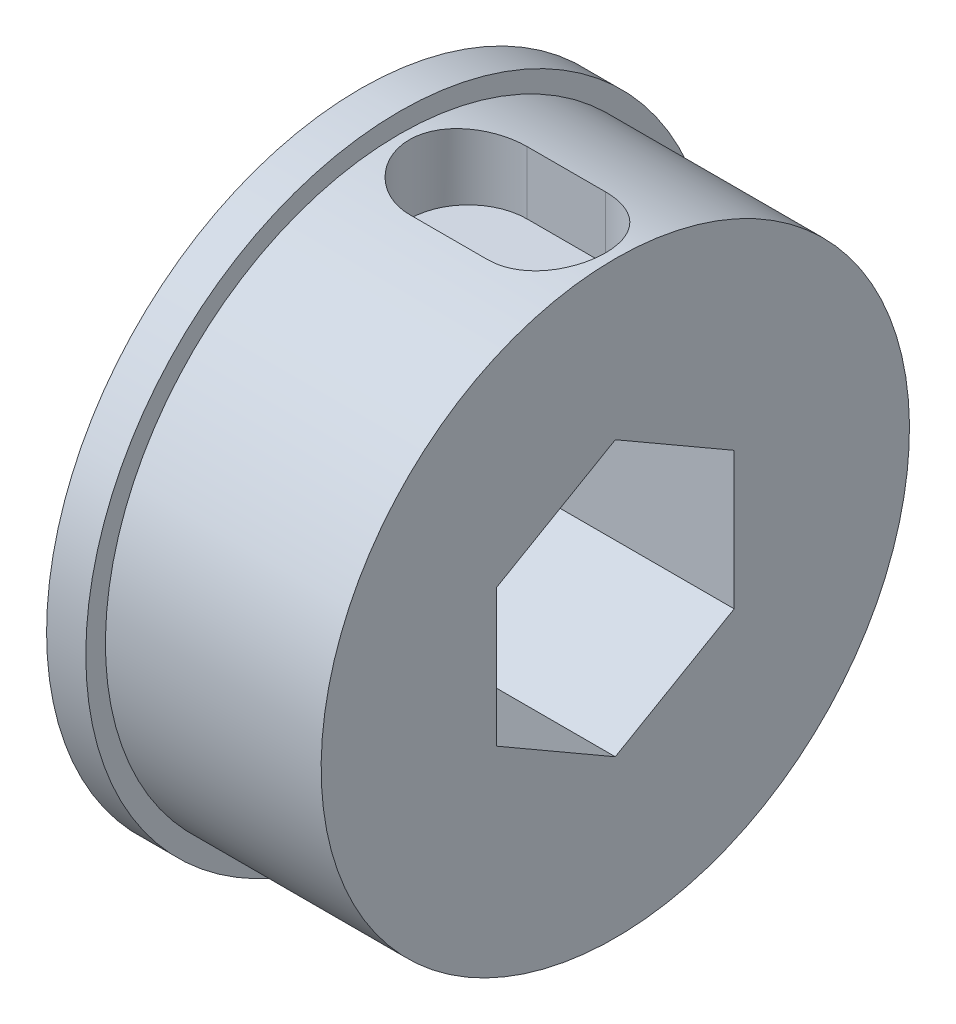
ISO-10303-21;
HEADER;
FILE_DESCRIPTION(('STEP AP214'),'2;1');
FILE_NAME('part.step','',(''),(''),'','','');
FILE_SCHEMA(('AUTOMOTIVE_DESIGN { 1 0 10303 214 1 1 1 1 }'));
ENDSEC;
DATA;
#1=APPLICATION_CONTEXT('core data for automotive mechanical design processes');
#2=APPLICATION_PROTOCOL_DEFINITION('international standard','automotive_design',2000,#1);
#3=PRODUCT_CONTEXT('',#1,'mechanical');
#4=PRODUCT('Part','Part','',(#3));
#5=PRODUCT_RELATED_PRODUCT_CATEGORY('part','',(#4));
#6=PRODUCT_DEFINITION_FORMATION('','',#4);
#7=PRODUCT_DEFINITION_CONTEXT('part definition',#1,'design');
#8=PRODUCT_DEFINITION('design','',#6,#7);
#9=PRODUCT_DEFINITION_SHAPE('','',#8);
#10=(LENGTH_UNIT() NAMED_UNIT(*) SI_UNIT(.MILLI.,.METRE.));
#11=(NAMED_UNIT(*) PLANE_ANGLE_UNIT() SI_UNIT($,.RADIAN.));
#12=(NAMED_UNIT(*) SI_UNIT($,.STERADIAN.) SOLID_ANGLE_UNIT());
#13=UNCERTAINTY_MEASURE_WITH_UNIT(LENGTH_MEASURE(1.E-05),#10,'distance_accuracy_value','');
#14=(GEOMETRIC_REPRESENTATION_CONTEXT(3) GLOBAL_UNCERTAINTY_ASSIGNED_CONTEXT((#13)) GLOBAL_UNIT_ASSIGNED_CONTEXT((#10,
#11,#12)) REPRESENTATION_CONTEXT('',''));
#15=CARTESIAN_POINT('',(0.,0.,0.));
#16=DIRECTION('',(0.,0.,1.));
#17=DIRECTION('',(1.,0.,0.));
#18=AXIS2_PLACEMENT_3D('',#15,#16,#17);
#19=CARTESIAN_POINT('',(0.,0.,0.));
#20=DIRECTION('',(-1.,0.,0.));
#21=DIRECTION('',(0.,-1.,0.));
#22=AXIS2_PLACEMENT_3D('',#19,#20,#21);
#23=PLANE('',#22);
#24=DIRECTION('',(0.,0.5,0.866025403784439));
#25=VECTOR('',#24,1.);
#26=CARTESIAN_POINT('',(0.,3.5,-6.06217782649107));
#27=LINE('',#26,#25);
#28=CARTESIAN_POINT('',(0.,3.5,-6.06217782649107));
#29=VERTEX_POINT('',#28);
#30=CARTESIAN_POINT('',(0.,7.,0.));
#31=VERTEX_POINT('',#30);
#32=EDGE_CURVE('E154',#29,#31,#27,.T.);
#33=ORIENTED_EDGE('',*,*,#32,.T.);
#34=DIRECTION('',(0.,-0.5,0.866025403784439));
#35=VECTOR('',#34,1.);
#36=CARTESIAN_POINT('',(0.,7.,0.));
#37=LINE('',#36,#35);
#38=CARTESIAN_POINT('',(0.,3.5,6.06217782649107));
#39=VERTEX_POINT('',#38);
#40=EDGE_CURVE('E158',#31,#39,#37,.T.);
#41=ORIENTED_EDGE('',*,*,#40,.T.);
#42=DIRECTION('',(0.,-1.,0.));
#43=VECTOR('',#42,1.);
#44=CARTESIAN_POINT('',(0.,3.5,6.06217782649107));
#45=LINE('',#44,#43);
#46=CARTESIAN_POINT('',(0.,-3.5,6.06217782649107));
#47=VERTEX_POINT('',#46);
#48=EDGE_CURVE('E61',#39,#47,#45,.T.);
#49=ORIENTED_EDGE('',*,*,#48,.T.);
#50=DIRECTION('',(0.,-0.5,-0.866025403784439));
#51=VECTOR('',#50,1.);
#52=CARTESIAN_POINT('',(0.,-3.5,6.06217782649107));
#53=LINE('',#52,#51);
#54=CARTESIAN_POINT('',(0.,-7.,0.));
#55=VERTEX_POINT('',#54);
#56=EDGE_CURVE('E165',#47,#55,#53,.T.);
#57=ORIENTED_EDGE('',*,*,#56,.T.);
#58=DIRECTION('',(0.,0.5,-0.866025403784439));
#59=VECTOR('',#58,1.);
#60=CARTESIAN_POINT('',(0.,-7.,0.));
#61=LINE('',#60,#59);
#62=CARTESIAN_POINT('',(0.,-3.5,-6.06217782649107));
#63=VERTEX_POINT('',#62);
#64=EDGE_CURVE('E169',#55,#63,#61,.T.);
#65=ORIENTED_EDGE('',*,*,#64,.T.);
#66=DIRECTION('',(0.,1.,0.));
#67=VECTOR('',#66,1.);
#68=CARTESIAN_POINT('',(0.,-3.5,-6.06217782649107));
#69=LINE('',#68,#67);
#70=EDGE_CURVE('E173',#63,#29,#69,.T.);
#71=ORIENTED_EDGE('',*,*,#70,.T.);
#72=EDGE_LOOP('',(#33,#41,#49,#57,#65,#71));
#73=FACE_BOUND('',#72,.T.);
#74=CARTESIAN_POINT('',(0.,0.,0.));
#75=DIRECTION('',(1.,0.,0.));
#76=DIRECTION('',(0.,1.,0.));
#77=AXIS2_PLACEMENT_3D('',#74,#75,#76);
#78=CIRCLE('',#77,16.);
#79=CARTESIAN_POINT('',(0.,16.,0.));
#80=VERTEX_POINT('',#79);
#81=EDGE_CURVE('E229',#80,#80,#78,.T.);
#82=ORIENTED_EDGE('',*,*,#81,.F.);
#83=EDGE_LOOP('',(#82));
#84=FACE_BOUND('',#83,.T.);
#85=ADVANCED_FACE('F39',(#73,#84),#23,.T.);
#86=CARTESIAN_POINT('',(13.,0.,0.));
#87=DIRECTION('',(1.,0.,0.));
#88=DIRECTION('',(0.,1.,0.));
#89=AXIS2_PLACEMENT_3D('',#86,#87,#88);
#90=CYLINDRICAL_SURFACE('',#89,16.);
#91=ORIENTED_EDGE('',*,*,#81,.T.);
#92=EDGE_LOOP('',(#91));
#93=FACE_BOUND('',#92,.T.);
#94=CARTESIAN_POINT('',(2.,0.,0.));
#95=DIRECTION('',(1.,0.,0.));
#96=DIRECTION('',(0.,1.,0.));
#97=AXIS2_PLACEMENT_3D('',#94,#95,#96);
#98=CIRCLE('',#97,16.);
#99=CARTESIAN_POINT('',(2.,16.,0.));
#100=VERTEX_POINT('',#99);
#101=EDGE_CURVE('E225',#100,#100,#98,.T.);
#102=ORIENTED_EDGE('',*,*,#101,.F.);
#103=EDGE_LOOP('',(#102));
#104=FACE_BOUND('',#103,.T.);
#105=ADVANCED_FACE('F291',(#93,#104),#90,.T.);
#106=CARTESIAN_POINT('',(2.,15.,0.));
#107=DIRECTION('',(1.,0.,0.));
#108=DIRECTION('',(0.,1.,0.));
#109=AXIS2_PLACEMENT_3D('',#106,#107,#108);
#110=PLANE('',#109);
#111=ORIENTED_EDGE('',*,*,#101,.T.);
#112=EDGE_LOOP('',(#111));
#113=FACE_BOUND('',#112,.T.);
#114=CARTESIAN_POINT('',(2.,0.,0.));
#115=DIRECTION('',(1.,0.,0.));
#116=DIRECTION('',(0.,1.,0.));
#117=AXIS2_PLACEMENT_3D('',#114,#115,#116);
#118=CIRCLE('',#117,15.);
#119=CARTESIAN_POINT('',(2.,15.,0.));
#120=VERTEX_POINT('',#119);
#121=EDGE_CURVE('E221',#120,#120,#118,.T.);
#122=ORIENTED_EDGE('',*,*,#121,.F.);
#123=EDGE_LOOP('',(#122));
#124=FACE_BOUND('',#123,.T.);
#125=ADVANCED_FACE('F276',(#113,#124),#110,.T.);
#126=CARTESIAN_POINT('',(13.,0.,0.));
#127=DIRECTION('',(1.,0.,0.));
#128=DIRECTION('',(0.,1.,0.));
#129=AXIS2_PLACEMENT_3D('',#126,#127,#128);
#130=CYLINDRICAL_SURFACE('',#129,15.);
#131=CARTESIAN_POINT('',(9.5,14.6969384566991,3.));
#132=CARTESIAN_POINT('',(9.58347680857854,14.6969312244577,3.00000906327289));
#133=CARTESIAN_POINT('',(9.66694861026169,14.6976495056175,2.99651591463671));
#134=CARTESIAN_POINT('',(9.83327809996906,14.7004835434339,2.98259549441824));
#135=CARTESIAN_POINT('',(9.91613586268055,14.7025991272148,2.97216908062491));
#136=CARTESIAN_POINT('',(10.0805290959827,14.708170006848,2.94447346178657));
#137=CARTESIAN_POINT('',(10.1620663848963,14.7116232616092,2.92721468106147));
#138=CARTESIAN_POINT('',(10.3233464127035,14.7197622168639,2.88600721568467));
#139=CARTESIAN_POINT('',(10.4030891442697,14.7244479223887,2.86205850372287));
#140=CARTESIAN_POINT('',(10.638805705615,14.7401631005323,2.78041527952091));
#141=CARTESIAN_POINT('',(10.7913980579565,14.7528553636172,2.71290158046862));
#142=CARTESIAN_POINT('',(11.0830273827463,14.7812320879208,2.55375565119918));
#143=CARTESIAN_POINT('',(11.2220629482138,14.7969168592162,2.46212092124304));
#144=CARTESIAN_POINT('',(11.4846705779563,14.829758124629,2.25594334606255));
#145=CARTESIAN_POINT('',(11.608026452483,14.8469306312349,2.14112719277709));
#146=CARTESIAN_POINT('',(11.8338657124384,14.8806728038384,1.89243128558791));
#147=CARTESIAN_POINT('',(11.9363458638714,14.8972423761055,1.75854858340981));
#148=CARTESIAN_POINT('',(12.1183660529863,14.9280843032166,1.47408029245692));
#149=CARTESIAN_POINT('',(12.1976987336169,14.9423354158867,1.3233595097447));
#150=CARTESIAN_POINT('',(12.3298278276436,14.9667526662081,1.01040357091221));
#151=CARTESIAN_POINT('',(12.3826281662009,14.9769194080515,0.848170122016171));
#152=CARTESIAN_POINT('',(12.4595210996834,14.9919095326336,0.519052235967753));
#153=CARTESIAN_POINT('',(12.4839823562064,14.996801475465,0.35225710622037));
#154=CARTESIAN_POINT('',(12.5046529505596,15.0009276525647,0.0168596277551904));
#155=CARTESIAN_POINT('',(12.5008643553944,15.0001623007697,-0.151742587839117));
#156=CARTESIAN_POINT('',(12.4654213956726,14.9931130332671,-0.483426607616186));
#157=CARTESIAN_POINT('',(12.4341648494247,14.9869079049386,-0.646552839896442));
#158=CARTESIAN_POINT('',(12.3453044699329,14.9697652350655,-0.96519601983751));
#159=CARTESIAN_POINT('',(12.2876997750647,14.9588275387594,-1.12071271847092));
#160=CARTESIAN_POINT('',(12.1474087892811,14.9333186736123,-1.42086081389148));
#161=CARTESIAN_POINT('',(12.0645662391597,14.918724971732,-1.56541718043671));
#162=CARTESIAN_POINT('',(11.8762691892324,14.8875135488761,-1.83871931366189));
#163=CARTESIAN_POINT('',(11.7708128154856,14.8708956602115,-1.96746376866398));
#164=CARTESIAN_POINT('',(11.5381149151072,14.8371311210549,-2.20783861961223));
#165=CARTESIAN_POINT('',(11.4105277937807,14.8199802972521,-2.31913408498719));
#166=CARTESIAN_POINT('',(11.1382857245379,14.7873511834928,-2.51883269969928));
#167=CARTESIAN_POINT('',(10.9936260645025,14.7718733575622,-2.60722950726484));
#168=CARTESIAN_POINT('',(10.690842785161,14.7443319012696,-2.75873986393405));
#169=CARTESIAN_POINT('',(10.5326839298099,14.7322775849504,-2.82178462990344));
#170=CARTESIAN_POINT('',(10.2078241062333,14.7130848318748,-2.9202212919898));
#171=CARTESIAN_POINT('',(10.0411362600556,14.7059390738486,-2.955654382453));
#172=CARTESIAN_POINT('',(9.81092954946066,14.7000953157589,-2.9844988143659));
#173=CARTESIAN_POINT('',(9.74883758065266,14.6989127961598,-2.99031376696653));
#174=CARTESIAN_POINT('',(9.62450640758773,14.6973350216032,-2.99805949399396));
#175=CARTESIAN_POINT('',(9.56226762513265,14.6969384491447,-2.99999676871397));
#176=CARTESIAN_POINT('',(9.49999999999999,14.6969384566991,-3.));
#177=B_SPLINE_CURVE_WITH_KNOTS('',3,(#131,#132,#133,#134,#135,#136,#137,#138,#139,#140,#141,
#142,#143,#144,#145,#146,#147,#148,#149,#150,#151,#152,#153,#154,#155,#156,#157,#158,#159,#160,
#161,#162,#163,#164,#165,#166,#167,#168,#169,#170,#171,#172,#173,#174,#175,#176),.UNSPECIFIED.,
.F.,.F.,(4,2,2,2,2,2,2,2,2,2,2,2,2,2,2,2,2,2,2,2,2,2,4),(0.,0.250345531073763,0.500660094964605,
0.750594210284376,1.00052934591733,1.5000082936227,1.99953902430944,2.50534477833307,
3.01122883056535,3.52151451068939,4.03172467755666,4.53522025544509,5.03867899358442,
5.53496413269304,6.03126550223829,6.53070440104676,7.03018470288859,7.53831354930086,
8.04658297164637,8.55622223384239,9.06509969273805,9.25212746067475,9.43884144366995),.UNSPECIFIED.);
#178=CARTESIAN_POINT('',(9.5,14.6969384566991,3.));
#179=VERTEX_POINT('',#178);
#180=CARTESIAN_POINT('',(9.49999999999999,14.6969384566991,-3.));
#181=VERTEX_POINT('',#180);
#182=EDGE_CURVE('E233',#179,#181,#177,.T.);
#183=ORIENTED_EDGE('',*,*,#182,.F.);
#184=DIRECTION('',(1.,0.,0.));
#185=VECTOR('',#184,1.);
#186=CARTESIAN_POINT('',(13.,14.6969384566991,3.));
#187=LINE('',#186,#185);
#188=CARTESIAN_POINT('',(5.49999999999999,14.6969384566991,3.));
#189=VERTEX_POINT('',#188);
#190=EDGE_CURVE('E11',#189,#179,#187,.T.);
#191=ORIENTED_EDGE('',*,*,#190,.F.);
#192=CARTESIAN_POINT('',(5.49999999999999,14.6969384566991,-3.));
#193=CARTESIAN_POINT('',(5.41652319142145,14.6969312244577,-3.00000906327289));
#194=CARTESIAN_POINT('',(5.3330513897383,14.6976495056175,-2.99651591463671));
#195=CARTESIAN_POINT('',(5.16672190003093,14.7004835434339,-2.98259549441824));
#196=CARTESIAN_POINT('',(5.08386413731944,14.7025991272148,-2.97216908062491));
#197=CARTESIAN_POINT('',(4.91947090401733,14.708170006848,-2.94447346178657));
#198=CARTESIAN_POINT('',(4.8379336151037,14.7116232616092,-2.92721468106147));
#199=CARTESIAN_POINT('',(4.67665358729653,14.7197622168639,-2.88600721568467));
#200=CARTESIAN_POINT('',(4.5969108557303,14.7244479223887,-2.86205850372287));
#201=CARTESIAN_POINT('',(4.36119429438502,14.7401631005323,-2.78041527952091));
#202=CARTESIAN_POINT('',(4.20860194204344,14.7528553636172,-2.71290158046862));
#203=CARTESIAN_POINT('',(3.91697261725372,14.7812320879208,-2.55375565119918));
#204=CARTESIAN_POINT('',(3.77793705178616,14.7969168592162,-2.46212092124304));
#205=CARTESIAN_POINT('',(3.51532942204371,14.829758124629,-2.25594334606255));
#206=CARTESIAN_POINT('',(3.39197354751698,14.8469306312349,-2.14112719277709));
#207=CARTESIAN_POINT('',(3.16613428756158,14.8806728038384,-1.89243128558791));
#208=CARTESIAN_POINT('',(3.06365413612861,14.8972423761055,-1.75854858340981));
#209=CARTESIAN_POINT('',(2.88163394701366,14.9280843032166,-1.47408029245692));
#210=CARTESIAN_POINT('',(2.80230126638314,14.9423354158867,-1.3233595097447));
#211=CARTESIAN_POINT('',(2.67017217235636,14.9667526662081,-1.01040357091221));
#212=CARTESIAN_POINT('',(2.61737183379912,14.9769194080515,-0.848170122016172));
#213=CARTESIAN_POINT('',(2.54047890031659,14.9919095326336,-0.519052235967754));
#214=CARTESIAN_POINT('',(2.5160176437936,14.996801475465,-0.35225710622037));
#215=CARTESIAN_POINT('',(2.4953470494404,15.0009276525647,-0.0168596277551909));
#216=CARTESIAN_POINT('',(2.49913564460562,15.0001623007697,0.151742587839117));
#217=CARTESIAN_POINT('',(2.53457860432743,14.9931130332671,0.483426607616187));
#218=CARTESIAN_POINT('',(2.56583515057532,14.9869079049386,0.646552839896442));
#219=CARTESIAN_POINT('',(2.65469553006708,14.9697652350655,0.96519601983751));
#220=CARTESIAN_POINT('',(2.71230022493534,14.9588275387594,1.12071271847092));
#221=CARTESIAN_POINT('',(2.85259121071889,14.9333186736123,1.42086081389148));
#222=CARTESIAN_POINT('',(2.93543376084029,14.918724971732,1.56541718043671));
#223=CARTESIAN_POINT('',(3.1237308107676,14.8875135488761,1.83871931366189));
#224=CARTESIAN_POINT('',(3.22918718451439,14.8708956602115,1.96746376866398));
#225=CARTESIAN_POINT('',(3.46188508489282,14.8371311210549,2.20783861961223));
#226=CARTESIAN_POINT('',(3.58947220621929,14.8199802972521,2.31913408498719));
#227=CARTESIAN_POINT('',(3.86171427546205,14.7873511834928,2.51883269969928));
#228=CARTESIAN_POINT('',(4.00637393549751,14.7718733575622,2.60722950726484));
#229=CARTESIAN_POINT('',(4.30915721483897,14.7443319012696,2.75873986393405));
#230=CARTESIAN_POINT('',(4.46731607019004,14.7322775849504,2.82178462990344));
#231=CARTESIAN_POINT('',(4.79217589376673,14.7130848318748,2.9202212919898));
#232=CARTESIAN_POINT('',(4.95886373994434,14.7059390738486,2.95565438245299));
#233=CARTESIAN_POINT('',(5.18907045053932,14.7000953157589,2.9844988143659));
#234=CARTESIAN_POINT('',(5.25116241934732,14.6989127961598,2.99031376696653));
#235=CARTESIAN_POINT('',(5.37549359241225,14.6973350216032,2.99805949399396));
#236=CARTESIAN_POINT('',(5.43773237486734,14.6969384491447,2.99999676871397));
#237=CARTESIAN_POINT('',(5.49999999999999,14.6969384566991,3.));
#238=B_SPLINE_CURVE_WITH_KNOTS('',3,(#192,#193,#194,#195,#196,#197,#198,#199,#200,#201,#202,
#203,#204,#205,#206,#207,#208,#209,#210,#211,#212,#213,#214,#215,#216,#217,#218,#219,#220,#221,
#222,#223,#224,#225,#226,#227,#228,#229,#230,#231,#232,#233,#234,#235,#236,#237),.UNSPECIFIED.,
.F.,.F.,(4,2,2,2,2,2,2,2,2,2,2,2,2,2,2,2,2,2,2,2,2,2,4),(0.,0.250345531073763,0.500660094964606,
0.750594210284375,1.00052934591733,1.5000082936227,1.99953902430944,2.50534477833307,
3.01122883056536,3.52151451068939,4.03172467755666,4.53522025544509,5.03867899358442,
5.53496413269305,6.03126550223829,6.53070440104676,7.03018470288859,7.53831354930087,
8.04658297164638,8.5562222338424,9.06509969273805,9.25212746067475,9.43884144366995),.UNSPECIFIED.);
#239=CARTESIAN_POINT('',(5.49999999999999,14.6969384566991,-3.));
#240=VERTEX_POINT('',#239);
#241=EDGE_CURVE('E47',#240,#189,#238,.T.);
#242=ORIENTED_EDGE('',*,*,#241,.F.);
#243=DIRECTION('',(1.,0.,0.));
#244=VECTOR('',#243,1.);
#245=CARTESIAN_POINT('',(13.,14.6969384566991,-3.));
#246=LINE('',#245,#244);
#247=EDGE_CURVE('E242',#181,#240,#246,.F.);
#248=ORIENTED_EDGE('',*,*,#247,.F.);
#249=EDGE_LOOP('',(#183,#191,#242,#248));
#250=FACE_BOUND('',#249,.T.);
#251=ORIENTED_EDGE('',*,*,#121,.T.);
#252=EDGE_LOOP('',(#251));
#253=FACE_BOUND('',#252,.T.);
#254=CARTESIAN_POINT('',(13.,0.,0.));
#255=DIRECTION('',(1.,0.,0.));
#256=DIRECTION('',(0.,1.,0.));
#257=AXIS2_PLACEMENT_3D('',#254,#255,#256);
#258=CIRCLE('',#257,15.);
#259=CARTESIAN_POINT('',(13.,15.,0.));
#260=VERTEX_POINT('',#259);
#261=EDGE_CURVE('E202',#260,#260,#258,.T.);
#262=ORIENTED_EDGE('',*,*,#261,.F.);
#263=EDGE_LOOP('',(#262));
#264=FACE_BOUND('',#263,.T.);
#265=ADVANCED_FACE('F243',(#250,#253,#264),#130,.T.);
#266=CARTESIAN_POINT('',(13.,15.,0.));
#267=DIRECTION('',(1.,0.,0.));
#268=DIRECTION('',(0.,1.,0.));
#269=AXIS2_PLACEMENT_3D('',#266,#267,#268);
#270=PLANE('',#269);
#271=DIRECTION('',(0.,0.5,0.866025403784439));
#272=VECTOR('',#271,1.);
#273=CARTESIAN_POINT('',(13.,3.5,-6.06217782649107));
#274=LINE('',#273,#272);
#275=CARTESIAN_POINT('',(13.,3.5,-6.06217782649107));
#276=VERTEX_POINT('',#275);
#277=CARTESIAN_POINT('',(13.,7.,0.));
#278=VERTEX_POINT('',#277);
#279=EDGE_CURVE('E147',#276,#278,#274,.T.);
#280=ORIENTED_EDGE('',*,*,#279,.F.);
#281=DIRECTION('',(0.,1.,0.));
#282=VECTOR('',#281,1.);
#283=CARTESIAN_POINT('',(13.,-3.5,-6.06217782649107));
#284=LINE('',#283,#282);
#285=CARTESIAN_POINT('',(13.,-3.5,-6.06217782649107));
#286=VERTEX_POINT('',#285);
#287=EDGE_CURVE('E159',#286,#276,#284,.T.);
#288=ORIENTED_EDGE('',*,*,#287,.F.);
#289=DIRECTION('',(0.,0.5,-0.866025403784439));
#290=VECTOR('',#289,1.);
#291=CARTESIAN_POINT('',(13.,-7.,0.));
#292=LINE('',#291,#290);
#293=CARTESIAN_POINT('',(13.,-7.,0.));
#294=VERTEX_POINT('',#293);
#295=EDGE_CURVE('E192',#294,#286,#292,.T.);
#296=ORIENTED_EDGE('',*,*,#295,.F.);
#297=DIRECTION('',(0.,-0.5,-0.866025403784439));
#298=VECTOR('',#297,1.);
#299=CARTESIAN_POINT('',(13.,-3.5,6.06217782649107));
#300=LINE('',#299,#298);
#301=CARTESIAN_POINT('',(13.,-3.5,6.06217782649107));
#302=VERTEX_POINT('',#301);
#303=EDGE_CURVE('E188',#302,#294,#300,.T.);
#304=ORIENTED_EDGE('',*,*,#303,.F.);
#305=DIRECTION('',(0.,-1.,0.));
#306=VECTOR('',#305,1.);
#307=CARTESIAN_POINT('',(13.,3.5,6.06217782649107));
#308=LINE('',#307,#306);
#309=CARTESIAN_POINT('',(13.,3.5,6.06217782649107));
#310=VERTEX_POINT('',#309);
#311=EDGE_CURVE('E184',#310,#302,#308,.T.);
#312=ORIENTED_EDGE('',*,*,#311,.F.);
#313=DIRECTION('',(0.,-0.5,0.866025403784439));
#314=VECTOR('',#313,1.);
#315=CARTESIAN_POINT('',(13.,7.,0.));
#316=LINE('',#315,#314);
#317=EDGE_CURVE('E180',#278,#310,#316,.T.);
#318=ORIENTED_EDGE('',*,*,#317,.F.);
#319=EDGE_LOOP('',(#280,#288,#296,#304,#312,#318));
#320=FACE_BOUND('',#319,.T.);
#321=ORIENTED_EDGE('',*,*,#261,.T.);
#322=EDGE_LOOP('',(#321));
#323=FACE_BOUND('',#322,.T.);
#324=ADVANCED_FACE('F275',(#320,#323),#270,.T.);
#325=CARTESIAN_POINT('',(0.,3.5,-6.06217782649107));
#326=DIRECTION('',(0.,0.866025403784439,-0.5));
#327=DIRECTION('',(0.,0.5,0.866025403784439));
#328=AXIS2_PLACEMENT_3D('',#325,#326,#327);
#329=PLANE('',#328);
#330=ORIENTED_EDGE('',*,*,#279,.T.);
#331=DIRECTION('',(1.,0.,0.));
#332=VECTOR('',#331,1.);
#333=CARTESIAN_POINT('',(0.,7.,0.));
#334=LINE('',#333,#332);
#335=EDGE_CURVE('E177',#31,#278,#334,.T.);
#336=ORIENTED_EDGE('',*,*,#335,.F.);
#337=ORIENTED_EDGE('',*,*,#32,.F.);
#338=DIRECTION('',(1.,0.,0.));
#339=VECTOR('',#338,1.);
#340=CARTESIAN_POINT('',(0.,3.5,-6.06217782649107));
#341=LINE('',#340,#339);
#342=EDGE_CURVE('E199',#29,#276,#341,.T.);
#343=ORIENTED_EDGE('',*,*,#342,.T.);
#344=EDGE_LOOP('',(#330,#336,#337,#343));
#345=FACE_BOUND('',#344,.T.);
#346=ADVANCED_FACE('F282',(#345),#329,.F.);
#347=CARTESIAN_POINT('',(0.,-3.5,-6.06217782649107));
#348=DIRECTION('',(0.,0.,-1.));
#349=DIRECTION('',(0.,1.,0.));
#350=AXIS2_PLACEMENT_3D('',#347,#348,#349);
#351=PLANE('',#350);
#352=ORIENTED_EDGE('',*,*,#287,.T.);
#353=ORIENTED_EDGE('',*,*,#342,.F.);
#354=ORIENTED_EDGE('',*,*,#70,.F.);
#355=DIRECTION('',(1.,0.,0.));
#356=VECTOR('',#355,1.);
#357=CARTESIAN_POINT('',(0.,-3.5,-6.06217782649107));
#358=LINE('',#357,#356);
#359=EDGE_CURVE('E203',#63,#286,#358,.T.);
#360=ORIENTED_EDGE('',*,*,#359,.T.);
#361=EDGE_LOOP('',(#352,#353,#354,#360));
#362=FACE_BOUND('',#361,.T.);
#363=ADVANCED_FACE('F261',(#362),#351,.F.);
#364=CARTESIAN_POINT('',(0.,-7.,0.));
#365=DIRECTION('',(0.,-0.866025403784438,-0.5));
#366=DIRECTION('',(0.,0.5,-0.866025403784439));
#367=AXIS2_PLACEMENT_3D('',#364,#365,#366);
#368=PLANE('',#367);
#369=ORIENTED_EDGE('',*,*,#295,.T.);
#370=ORIENTED_EDGE('',*,*,#359,.F.);
#371=ORIENTED_EDGE('',*,*,#64,.F.);
#372=DIRECTION('',(1.,0.,0.));
#373=VECTOR('',#372,1.);
#374=CARTESIAN_POINT('',(0.,-7.,0.));
#375=LINE('',#374,#373);
#376=EDGE_CURVE('E206',#55,#294,#375,.T.);
#377=ORIENTED_EDGE('',*,*,#376,.T.);
#378=EDGE_LOOP('',(#369,#370,#371,#377));
#379=FACE_BOUND('',#378,.T.);
#380=ADVANCED_FACE('F369',(#379),#368,.F.);
#381=CARTESIAN_POINT('',(0.,-3.5,6.06217782649107));
#382=DIRECTION('',(0.,-0.866025403784439,0.5));
#383=DIRECTION('',(0.,-0.5,-0.866025403784439));
#384=AXIS2_PLACEMENT_3D('',#381,#382,#383);
#385=PLANE('',#384);
#386=ORIENTED_EDGE('',*,*,#303,.T.);
#387=ORIENTED_EDGE('',*,*,#376,.F.);
#388=ORIENTED_EDGE('',*,*,#56,.F.);
#389=DIRECTION('',(1.,0.,0.));
#390=VECTOR('',#389,1.);
#391=CARTESIAN_POINT('',(0.,-3.5,6.06217782649107));
#392=LINE('',#391,#390);
#393=EDGE_CURVE('E209',#47,#302,#392,.T.);
#394=ORIENTED_EDGE('',*,*,#393,.T.);
#395=EDGE_LOOP('',(#386,#387,#388,#394));
#396=FACE_BOUND('',#395,.T.);
#397=ADVANCED_FACE('F362',(#396),#385,.F.);
#398=CARTESIAN_POINT('',(0.,3.5,6.06217782649107));
#399=DIRECTION('',(0.,0.,1.));
#400=DIRECTION('',(0.,-1.,0.));
#401=AXIS2_PLACEMENT_3D('',#398,#399,#400);
#402=PLANE('',#401);
#403=ORIENTED_EDGE('',*,*,#311,.T.);
#404=ORIENTED_EDGE('',*,*,#393,.F.);
#405=ORIENTED_EDGE('',*,*,#48,.F.);
#406=DIRECTION('',(1.,0.,0.));
#407=VECTOR('',#406,1.);
#408=CARTESIAN_POINT('',(0.,3.5,6.06217782649107));
#409=LINE('',#408,#407);
#410=EDGE_CURVE('E212',#39,#310,#409,.T.);
#411=ORIENTED_EDGE('',*,*,#410,.T.);
#412=EDGE_LOOP('',(#403,#404,#405,#411));
#413=FACE_BOUND('',#412,.T.);
#414=ADVANCED_FACE('F357',(#413),#402,.F.);
#415=CARTESIAN_POINT('',(0.,7.,0.));
#416=DIRECTION('',(0.,0.866025403784439,0.5));
#417=DIRECTION('',(0.,-0.5,0.866025403784439));
#418=AXIS2_PLACEMENT_3D('',#415,#416,#417);
#419=PLANE('',#418);
#420=ORIENTED_EDGE('',*,*,#317,.T.);
#421=ORIENTED_EDGE('',*,*,#410,.F.);
#422=ORIENTED_EDGE('',*,*,#40,.F.);
#423=ORIENTED_EDGE('',*,*,#335,.T.);
#424=EDGE_LOOP('',(#420,#421,#422,#423));
#425=FACE_BOUND('',#424,.T.);
#426=ADVANCED_FACE('F260',(#425),#419,.F.);
#427=CARTESIAN_POINT('',(5.49999999999999,11.5,0.));
#428=DIRECTION('',(0.,1.,0.));
#429=DIRECTION('',(0.,0.,1.));
#430=AXIS2_PLACEMENT_3D('',#427,#428,#429);
#431=CYLINDRICAL_SURFACE('',#430,3.);
#432=DIRECTION('',(0.,1.,0.));
#433=VECTOR('',#432,1.);
#434=CARTESIAN_POINT('',(5.49999999999999,11.5,-3.));
#435=LINE('',#434,#433);
#436=CARTESIAN_POINT('',(5.49999999999999,11.5,-3.));
#437=VERTEX_POINT('',#436);
#438=EDGE_CURVE('E144',#437,#240,#435,.T.);
#439=ORIENTED_EDGE('',*,*,#438,.T.);
#440=ORIENTED_EDGE('',*,*,#241,.T.);
#441=DIRECTION('',(0.,1.,0.));
#442=VECTOR('',#441,1.);
#443=CARTESIAN_POINT('',(5.49999999999999,11.5,3.));
#444=LINE('',#443,#442);
#445=CARTESIAN_POINT('',(5.49999999999999,11.5,3.));
#446=VERTEX_POINT('',#445);
#447=EDGE_CURVE('E53',#446,#189,#444,.T.);
#448=ORIENTED_EDGE('',*,*,#447,.F.);
#449=CARTESIAN_POINT('',(5.49999999999999,11.5,0.));
#450=DIRECTION('',(0.,1.,0.));
#451=DIRECTION('',(0.,0.,1.));
#452=AXIS2_PLACEMENT_3D('',#449,#450,#451);
#453=CIRCLE('',#452,3.);
#454=EDGE_CURVE('E118',#437,#446,#453,.T.);
#455=ORIENTED_EDGE('',*,*,#454,.F.);
#456=EDGE_LOOP('',(#439,#440,#448,#455));
#457=FACE_BOUND('',#456,.T.);
#458=ADVANCED_FACE('F116',(#457),#431,.F.);
#459=CARTESIAN_POINT('',(5.49999999999999,11.5,-3.));
#460=DIRECTION('',(0.,0.,-1.));
#461=DIRECTION('',(-1.,0.,0.));
#462=AXIS2_PLACEMENT_3D('',#459,#460,#461);
#463=PLANE('',#462);
#464=ORIENTED_EDGE('',*,*,#247,.T.);
#465=ORIENTED_EDGE('',*,*,#438,.F.);
#466=DIRECTION('',(-1.,0.,0.));
#467=VECTOR('',#466,1.);
#468=CARTESIAN_POINT('',(5.49999999999999,11.5,-3.));
#469=LINE('',#468,#467);
#470=CARTESIAN_POINT('',(9.49999999999999,11.5,-3.));
#471=VERTEX_POINT('',#470);
#472=EDGE_CURVE('E123',#471,#437,#469,.T.);
#473=ORIENTED_EDGE('',*,*,#472,.F.);
#474=DIRECTION('',(0.,1.,0.));
#475=VECTOR('',#474,1.);
#476=CARTESIAN_POINT('',(9.49999999999999,11.5,-3.));
#477=LINE('',#476,#475);
#478=EDGE_CURVE('E148',#471,#181,#477,.T.);
#479=ORIENTED_EDGE('',*,*,#478,.T.);
#480=EDGE_LOOP('',(#464,#465,#473,#479));
#481=FACE_BOUND('',#480,.T.);
#482=ADVANCED_FACE('F252',(#481),#463,.F.);
#483=CARTESIAN_POINT('',(9.49999999999999,11.5,0.));
#484=DIRECTION('',(0.,1.,0.));
#485=DIRECTION('',(0.,0.,1.));
#486=AXIS2_PLACEMENT_3D('',#483,#484,#485);
#487=CYLINDRICAL_SURFACE('',#486,3.);
#488=DIRECTION('',(0.,1.,0.));
#489=VECTOR('',#488,1.);
#490=CARTESIAN_POINT('',(9.5,11.5,3.));
#491=LINE('',#490,#489);
#492=CARTESIAN_POINT('',(9.5,11.5,3.));
#493=VERTEX_POINT('',#492);
#494=EDGE_CURVE('E122',#493,#179,#491,.T.);
#495=ORIENTED_EDGE('',*,*,#494,.T.);
#496=ORIENTED_EDGE('',*,*,#182,.T.);
#497=ORIENTED_EDGE('',*,*,#478,.F.);
#498=CARTESIAN_POINT('',(9.49999999999999,11.5,0.));
#499=DIRECTION('',(0.,1.,0.));
#500=DIRECTION('',(0.,0.,1.));
#501=AXIS2_PLACEMENT_3D('',#498,#499,#500);
#502=CIRCLE('',#501,3.);
#503=EDGE_CURVE('E133',#493,#471,#502,.T.);
#504=ORIENTED_EDGE('',*,*,#503,.F.);
#505=EDGE_LOOP('',(#495,#496,#497,#504));
#506=FACE_BOUND('',#505,.T.);
#507=ADVANCED_FACE('F247',(#506),#487,.F.);
#508=CARTESIAN_POINT('',(5.49999999999999,11.5,3.));
#509=DIRECTION('',(0.,0.,1.));
#510=DIRECTION('',(1.,0.,0.));
#511=AXIS2_PLACEMENT_3D('',#508,#509,#510);
#512=PLANE('',#511);
#513=ORIENTED_EDGE('',*,*,#190,.T.);
#514=ORIENTED_EDGE('',*,*,#494,.F.);
#515=DIRECTION('',(1.,0.,0.));
#516=VECTOR('',#515,1.);
#517=CARTESIAN_POINT('',(5.49999999999999,11.5,3.));
#518=LINE('',#517,#516);
#519=EDGE_CURVE('E126',#446,#493,#518,.T.);
#520=ORIENTED_EDGE('',*,*,#519,.F.);
#521=ORIENTED_EDGE('',*,*,#447,.T.);
#522=EDGE_LOOP('',(#513,#514,#520,#521));
#523=FACE_BOUND('',#522,.T.);
#524=ADVANCED_FACE('F127',(#523),#512,.F.);
#525=CARTESIAN_POINT('',(5.49999999999999,11.5,0.));
#526=DIRECTION('',(0.,1.,0.));
#527=DIRECTION('',(0.,0.,1.));
#528=AXIS2_PLACEMENT_3D('',#525,#526,#527);
#529=PLANE('',#528);
#530=ORIENTED_EDGE('',*,*,#454,.T.);
#531=ORIENTED_EDGE('',*,*,#519,.T.);
#532=ORIENTED_EDGE('',*,*,#503,.T.);
#533=ORIENTED_EDGE('',*,*,#472,.T.);
#534=EDGE_LOOP('',(#530,#531,#532,#533));
#535=FACE_BOUND('',#534,.T.);
#536=ADVANCED_FACE('F135',(#535),#529,.T.);
#537=CLOSED_SHELL('',(#85,#105,#125,#265,#324,#346,#363,#380,#397,#414,#426,#458,#482,#507,#524,#536));
#538=MANIFOLD_SOLID_BREP('B2',#537);
#539=ADVANCED_BREP_SHAPE_REPRESENTATION('',(#18,#538),#14);
#540=SHAPE_DEFINITION_REPRESENTATION(#9,#539);
ENDSEC;
END-ISO-10303-21;
